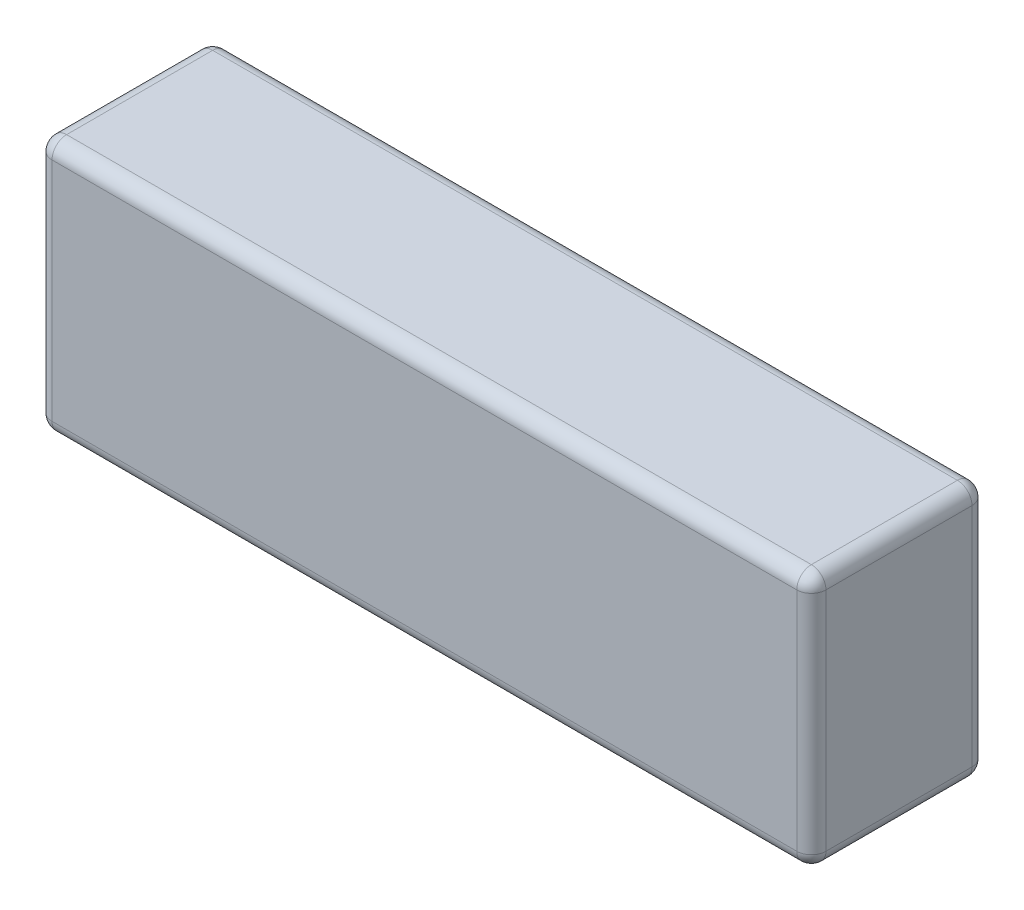
ISO-10303-21;
HEADER;
FILE_DESCRIPTION(('STEP AP214'),'2;1');
FILE_NAME('part.step','',(''),(''),'','','');
FILE_SCHEMA(('AUTOMOTIVE_DESIGN { 1 0 10303 214 1 1 1 1 }'));
ENDSEC;
DATA;
#1=APPLICATION_CONTEXT('core data for automotive mechanical design processes');
#2=APPLICATION_PROTOCOL_DEFINITION('international standard','automotive_design',2000,#1);
#3=PRODUCT_CONTEXT('',#1,'mechanical');
#4=PRODUCT('Part','Part','',(#3));
#5=PRODUCT_RELATED_PRODUCT_CATEGORY('part','',(#4));
#6=PRODUCT_DEFINITION_FORMATION('','',#4);
#7=PRODUCT_DEFINITION_CONTEXT('part definition',#1,'design');
#8=PRODUCT_DEFINITION('design','',#6,#7);
#9=PRODUCT_DEFINITION_SHAPE('','',#8);
#10=(LENGTH_UNIT() NAMED_UNIT(*) SI_UNIT(.MILLI.,.METRE.));
#11=(NAMED_UNIT(*) PLANE_ANGLE_UNIT() SI_UNIT($,.RADIAN.));
#12=(NAMED_UNIT(*) SI_UNIT($,.STERADIAN.) SOLID_ANGLE_UNIT());
#13=UNCERTAINTY_MEASURE_WITH_UNIT(LENGTH_MEASURE(1.E-05),#10,'distance_accuracy_value','');
#14=(GEOMETRIC_REPRESENTATION_CONTEXT(3) GLOBAL_UNCERTAINTY_ASSIGNED_CONTEXT((#13)) GLOBAL_UNIT_ASSIGNED_CONTEXT((#10,
#11,#12)) REPRESENTATION_CONTEXT('',''));
#15=CARTESIAN_POINT('',(0.,0.,0.));
#16=DIRECTION('',(0.,0.,1.));
#17=DIRECTION('',(1.,0.,0.));
#18=AXIS2_PLACEMENT_3D('',#15,#16,#17);
#19=CARTESIAN_POINT('',(-63.5650039022139,18.7208480700783,-11.4465056239155));
#20=DIRECTION('',(-1.,0.,0.));
#21=DIRECTION('',(0.,0.,1.));
#22=AXIS2_PLACEMENT_3D('',#19,#20,#21);
#23=PLANE('',#22);
#24=CARTESIAN_POINT('',(-63.5650039022139,18.7208480700783,-11.4465056239155));
#25=DIRECTION('',(-1.,0.,0.));
#26=DIRECTION('',(0.,0.,1.));
#27=AXIS2_PLACEMENT_3D('',#24,#25,#26);
#28=CIRCLE('',#27,7.98880999035675);
#29=CARTESIAN_POINT('',(-63.5650039022139,18.7208480700783,-19.4353156142722));
#30=VERTEX_POINT('',#29);
#31=CARTESIAN_POINT('',(-63.5650039022139,18.7208480700783,-3.45769563355872));
#32=VERTEX_POINT('',#31);
#33=EDGE_CURVE('E10',#30,#32,#28,.T.);
#34=ORIENTED_EDGE('',*,*,#33,.T.);
#35=CARTESIAN_POINT('',(-63.5650039022139,18.7208480700783,-11.4465056239155));
#36=DIRECTION('',(-1.,0.,0.));
#37=DIRECTION('',(0.,0.,1.));
#38=AXIS2_PLACEMENT_3D('',#35,#36,#37);
#39=CIRCLE('',#38,7.98880999035675);
#40=EDGE_CURVE('E204',#32,#30,#39,.T.);
#41=ORIENTED_EDGE('',*,*,#40,.T.);
#42=EDGE_LOOP('',(#34,#41));
#43=FACE_BOUND('',#42,.T.);
#44=ADVANCED_FACE('F16',(#43),#23,.T.);
#45=CARTESIAN_POINT('',(-63.5650039022139,18.7208480700783,-11.4465056239155));
#46=DIRECTION('',(1.,0.,0.));
#47=DIRECTION('',(0.,0.,-1.));
#48=AXIS2_PLACEMENT_3D('',#45,#46,#47);
#49=CYLINDRICAL_SURFACE('',#48,7.98880999035675);
#50=DIRECTION('',(1.,0.,0.));
#51=VECTOR('',#50,1.);
#52=CARTESIAN_POINT('',(-63.5650039022139,18.7208480700783,-3.45769563355872));
#53=LINE('',#52,#51);
#54=CARTESIAN_POINT('',(-62.5650039022139,18.7208480700783,-3.45769563355872));
#55=VERTEX_POINT('',#54);
#56=EDGE_CURVE('E206',#32,#55,#53,.T.);
#57=ORIENTED_EDGE('',*,*,#56,.F.);
#58=ORIENTED_EDGE('',*,*,#33,.F.);
#59=DIRECTION('',(1.,0.,0.));
#60=VECTOR('',#59,1.);
#61=CARTESIAN_POINT('',(-63.5650039022139,18.7208480700783,-19.4353156142722));
#62=LINE('',#61,#60);
#63=CARTESIAN_POINT('',(-62.5650039022139,18.7208480700783,-19.4353156142722));
#64=VERTEX_POINT('',#63);
#65=EDGE_CURVE('E209',#30,#64,#62,.T.);
#66=ORIENTED_EDGE('',*,*,#65,.T.);
#67=CARTESIAN_POINT('',(-62.5650039022139,18.7208480700783,-11.4465056239155));
#68=DIRECTION('',(-1.,0.,0.));
#69=DIRECTION('',(0.,0.,-1.));
#70=AXIS2_PLACEMENT_3D('',#67,#68,#69);
#71=CIRCLE('',#70,7.98880999035675);
#72=EDGE_CURVE('E241',#64,#55,#71,.T.);
#73=ORIENTED_EDGE('',*,*,#72,.T.);
#74=EDGE_LOOP('',(#57,#58,#66,#73));
#75=FACE_BOUND('',#74,.T.);
#76=ADVANCED_FACE('F436',(#75),#49,.T.);
#77=CARTESIAN_POINT('',(-60.5650039022139,35.,-0.807978011174984));
#78=DIRECTION('',(0.,-1.,0.));
#79=DIRECTION('',(0.,0.,-1.));
#80=AXIS2_PLACEMENT_3D('',#77,#78,#79);
#81=CYLINDRICAL_SURFACE('',#80,2.);
#82=CARTESIAN_POINT('',(-60.5650039022139,33.,-0.807978011174984));
#83=DIRECTION('',(0.,-1.,0.));
#84=DIRECTION('',(0.,0.,1.));
#85=AXIS2_PLACEMENT_3D('',#82,#83,#84);
#86=CIRCLE('',#85,2.);
#87=CARTESIAN_POINT('',(-60.5650039022139,33.,1.19202198882502));
#88=VERTEX_POINT('',#87);
#89=CARTESIAN_POINT('',(-62.5650039022139,33.,-0.807978011174984));
#90=VERTEX_POINT('',#89);
#91=EDGE_CURVE('E360',#88,#90,#86,.T.);
#92=ORIENTED_EDGE('',*,*,#91,.T.);
#93=DIRECTION('',(0.,1.,0.));
#94=VECTOR('',#93,1.);
#95=CARTESIAN_POINT('',(-62.5650039022139,35.,-0.807978011174986));
#96=LINE('',#95,#94);
#97=CARTESIAN_POINT('',(-62.5650039022139,2.,-0.807978011174984));
#98=VERTEX_POINT('',#97);
#99=EDGE_CURVE('E228',#98,#90,#96,.T.);
#100=ORIENTED_EDGE('',*,*,#99,.F.);
#101=CARTESIAN_POINT('',(-60.5650039022139,2.,-0.807978011174984));
#102=DIRECTION('',(0.,1.,0.));
#103=DIRECTION('',(0.,0.,-1.));
#104=AXIS2_PLACEMENT_3D('',#101,#102,#103);
#105=CIRCLE('',#104,2.);
#106=CARTESIAN_POINT('',(-60.5650039022139,2.,1.19202198882502));
#107=VERTEX_POINT('',#106);
#108=EDGE_CURVE('E24',#98,#107,#105,.T.);
#109=ORIENTED_EDGE('',*,*,#108,.T.);
#110=DIRECTION('',(0.,-1.,0.));
#111=VECTOR('',#110,1.);
#112=CARTESIAN_POINT('',(-60.5650039022139,35.,1.19202198882502));
#113=LINE('',#112,#111);
#114=EDGE_CURVE('E195',#88,#107,#113,.T.);
#115=ORIENTED_EDGE('',*,*,#114,.F.);
#116=EDGE_LOOP('',(#92,#100,#109,#115));
#117=FACE_BOUND('',#116,.T.);
#118=ADVANCED_FACE('F365',(#117),#81,.T.);
#119=CARTESIAN_POINT('',(-60.5650039022139,2.,-0.807978011174984));
#120=DIRECTION('',(1.,0.,0.));
#121=DIRECTION('',(0.,0.,-1.));
#122=AXIS2_PLACEMENT_3D('',#119,#120,#121);
#123=SPHERICAL_SURFACE('',#122,2.);
#124=CARTESIAN_POINT('',(-60.5650039022139,2.,-0.807978011174984));
#125=DIRECTION('',(0.,0.,1.));
#126=DIRECTION('',(1.,0.,0.));
#127=AXIS2_PLACEMENT_3D('',#124,#125,#126);
#128=CIRCLE('',#127,2.);
#129=CARTESIAN_POINT('',(-60.5650039022139,0.,-0.807978011174984));
#130=VERTEX_POINT('',#129);
#131=EDGE_CURVE('E353',#98,#130,#128,.T.);
#132=ORIENTED_EDGE('',*,*,#131,.T.);
#133=CARTESIAN_POINT('',(-60.5650039022139,2.,-0.807978011174984));
#134=DIRECTION('',(-1.,0.,0.));
#135=DIRECTION('',(0.,0.,1.));
#136=AXIS2_PLACEMENT_3D('',#133,#134,#135);
#137=CIRCLE('',#136,2.);
#138=EDGE_CURVE('E349',#130,#107,#137,.T.);
#139=ORIENTED_EDGE('',*,*,#138,.T.);
#140=ORIENTED_EDGE('',*,*,#108,.F.);
#141=EDGE_LOOP('',(#132,#139,#140));
#142=FACE_BOUND('',#141,.T.);
#143=ADVANCED_FACE('F370',(#142),#123,.T.);
#144=CARTESIAN_POINT('',(-60.5650039022139,33.,-0.807978011174984));
#145=DIRECTION('',(1.,0.,0.));
#146=DIRECTION('',(0.,0.,1.));
#147=AXIS2_PLACEMENT_3D('',#144,#145,#146);
#148=SPHERICAL_SURFACE('',#147,2.);
#149=CARTESIAN_POINT('',(-60.5650039022139,33.,-0.807978011174984));
#150=DIRECTION('',(-1.,0.,0.));
#151=DIRECTION('',(0.,0.,1.));
#152=AXIS2_PLACEMENT_3D('',#149,#150,#151);
#153=CIRCLE('',#152,2.);
#154=CARTESIAN_POINT('',(-60.5650039022139,35.,-0.807978011174984));
#155=VERTEX_POINT('',#154);
#156=EDGE_CURVE('E346',#88,#155,#153,.T.);
#157=ORIENTED_EDGE('',*,*,#156,.T.);
#158=CARTESIAN_POINT('',(-60.5650039022139,33.,-0.807978011174984));
#159=DIRECTION('',(0.,0.,1.));
#160=DIRECTION('',(1.,0.,0.));
#161=AXIS2_PLACEMENT_3D('',#158,#159,#160);
#162=CIRCLE('',#161,2.);
#163=EDGE_CURVE('E343',#155,#90,#162,.T.);
#164=ORIENTED_EDGE('',*,*,#163,.T.);
#165=ORIENTED_EDGE('',*,*,#91,.F.);
#166=EDGE_LOOP('',(#157,#164,#165));
#167=FACE_BOUND('',#166,.T.);
#168=ADVANCED_FACE('F391',(#167),#148,.T.);
#169=CARTESIAN_POINT('',(-60.5650039022139,2.,-22.807978011175));
#170=DIRECTION('',(0.,0.,-1.));
#171=DIRECTION('',(-1.,0.,0.));
#172=AXIS2_PLACEMENT_3D('',#169,#170,#171);
#173=CYLINDRICAL_SURFACE('',#172,2.);
#174=CARTESIAN_POINT('',(-60.5650039022139,2.,-20.807978011175));
#175=DIRECTION('',(0.,0.,1.));
#176=DIRECTION('',(-1.,0.,0.));
#177=AXIS2_PLACEMENT_3D('',#174,#175,#176);
#178=CIRCLE('',#177,2.);
#179=CARTESIAN_POINT('',(-62.5650039022139,2.,-20.807978011175));
#180=VERTEX_POINT('',#179);
#181=CARTESIAN_POINT('',(-60.5650039022139,0.,-20.807978011175));
#182=VERTEX_POINT('',#181);
#183=EDGE_CURVE('E48',#180,#182,#178,.T.);
#184=ORIENTED_EDGE('',*,*,#183,.T.);
#185=DIRECTION('',(0.,0.,-1.));
#186=VECTOR('',#185,1.);
#187=CARTESIAN_POINT('',(-60.5650039022139,0.,-22.807978011175));
#188=LINE('',#187,#186);
#189=EDGE_CURVE('E283',#130,#182,#188,.T.);
#190=ORIENTED_EDGE('',*,*,#189,.F.);
#191=ORIENTED_EDGE('',*,*,#131,.F.);
#192=DIRECTION('',(0.,0.,1.));
#193=VECTOR('',#192,1.);
#194=CARTESIAN_POINT('',(-62.5650039022139,2.,1.19202198882502));
#195=LINE('',#194,#193);
#196=EDGE_CURVE('E212',#180,#98,#195,.T.);
#197=ORIENTED_EDGE('',*,*,#196,.F.);
#198=EDGE_LOOP('',(#184,#190,#191,#197));
#199=FACE_BOUND('',#198,.T.);
#200=ADVANCED_FACE('F366',(#199),#173,.T.);
#201=CARTESIAN_POINT('',(43.4349960977861,2.,-0.807978011174984));
#202=DIRECTION('',(-1.,0.,0.));
#203=DIRECTION('',(0.,0.,1.));
#204=AXIS2_PLACEMENT_3D('',#201,#202,#203);
#205=CYLINDRICAL_SURFACE('',#204,2.);
#206=CARTESIAN_POINT('',(41.4349960977861,2.,-0.807978011174984));
#207=DIRECTION('',(-1.,0.,0.));
#208=DIRECTION('',(0.,0.,-1.));
#209=AXIS2_PLACEMENT_3D('',#206,#207,#208);
#210=CIRCLE('',#209,2.);
#211=CARTESIAN_POINT('',(41.4349960977861,0.,-0.807978011174984));
#212=VERTEX_POINT('',#211);
#213=CARTESIAN_POINT('',(41.4349960977861,2.,1.19202198882502));
#214=VERTEX_POINT('',#213);
#215=EDGE_CURVE('E152',#212,#214,#210,.T.);
#216=ORIENTED_EDGE('',*,*,#215,.T.);
#217=DIRECTION('',(1.,0.,0.));
#218=VECTOR('',#217,1.);
#219=CARTESIAN_POINT('',(43.4349960977861,2.,1.19202198882502));
#220=LINE('',#219,#218);
#221=EDGE_CURVE('E157',#107,#214,#220,.T.);
#222=ORIENTED_EDGE('',*,*,#221,.F.);
#223=ORIENTED_EDGE('',*,*,#138,.F.);
#224=DIRECTION('',(-1.,0.,0.));
#225=VECTOR('',#224,1.);
#226=CARTESIAN_POINT('',(-62.5650039022139,0.,-0.807978011174984));
#227=LINE('',#226,#225);
#228=EDGE_CURVE('E165',#212,#130,#227,.T.);
#229=ORIENTED_EDGE('',*,*,#228,.F.);
#230=EDGE_LOOP('',(#216,#222,#223,#229));
#231=FACE_BOUND('',#230,.T.);
#232=ADVANCED_FACE('F156',(#231),#205,.T.);
#233=CARTESIAN_POINT('',(0.,33.,-0.807978011174984));
#234=DIRECTION('',(1.,0.,0.));
#235=DIRECTION('',(0.,0.,-1.));
#236=AXIS2_PLACEMENT_3D('',#233,#234,#235);
#237=CYLINDRICAL_SURFACE('',#236,2.);
#238=CARTESIAN_POINT('',(41.4349960977861,33.,-0.807978011174984));
#239=DIRECTION('',(-1.,0.,0.));
#240=DIRECTION('',(0.,0.,-1.));
#241=AXIS2_PLACEMENT_3D('',#238,#239,#240);
#242=CIRCLE('',#241,2.);
#243=CARTESIAN_POINT('',(41.4349960977861,33.,1.19202198882502));
#244=VERTEX_POINT('',#243);
#245=CARTESIAN_POINT('',(41.4349960977861,35.,-0.807978011174984));
#246=VERTEX_POINT('',#245);
#247=EDGE_CURVE('E167',#244,#246,#242,.T.);
#248=ORIENTED_EDGE('',*,*,#247,.T.);
#249=DIRECTION('',(1.,0.,0.));
#250=VECTOR('',#249,1.);
#251=CARTESIAN_POINT('',(0.,35.,-0.807978011174984));
#252=LINE('',#251,#250);
#253=EDGE_CURVE('E273',#155,#246,#252,.T.);
#254=ORIENTED_EDGE('',*,*,#253,.F.);
#255=ORIENTED_EDGE('',*,*,#156,.F.);
#256=DIRECTION('',(-1.,0.,0.));
#257=VECTOR('',#256,1.);
#258=CARTESIAN_POINT('',(43.4349960977861,33.,1.19202198882502));
#259=LINE('',#258,#257);
#260=EDGE_CURVE('E199',#244,#88,#259,.T.);
#261=ORIENTED_EDGE('',*,*,#260,.F.);
#262=EDGE_LOOP('',(#248,#254,#255,#261));
#263=FACE_BOUND('',#262,.T.);
#264=ADVANCED_FACE('F390',(#263),#237,.T.);
#265=CARTESIAN_POINT('',(-60.5650039022139,33.,0.));
#266=DIRECTION('',(0.,0.,1.));
#267=DIRECTION('',(1.,0.,0.));
#268=AXIS2_PLACEMENT_3D('',#265,#266,#267);
#269=CYLINDRICAL_SURFACE('',#268,2.);
#270=CARTESIAN_POINT('',(-60.5650039022139,33.,-20.807978011175));
#271=DIRECTION('',(0.,0.,1.));
#272=DIRECTION('',(-1.,0.,0.));
#273=AXIS2_PLACEMENT_3D('',#270,#271,#272);
#274=CIRCLE('',#273,2.);
#275=CARTESIAN_POINT('',(-60.5650039022139,35.,-20.807978011175));
#276=VERTEX_POINT('',#275);
#277=CARTESIAN_POINT('',(-62.5650039022139,33.,-20.807978011175));
#278=VERTEX_POINT('',#277);
#279=EDGE_CURVE('E336',#276,#278,#274,.T.);
#280=ORIENTED_EDGE('',*,*,#279,.T.);
#281=DIRECTION('',(0.,0.,-1.));
#282=VECTOR('',#281,1.);
#283=CARTESIAN_POINT('',(-62.5650039022139,33.,-22.807978011175));
#284=LINE('',#283,#282);
#285=EDGE_CURVE('E233',#90,#278,#284,.T.);
#286=ORIENTED_EDGE('',*,*,#285,.F.);
#287=ORIENTED_EDGE('',*,*,#163,.F.);
#288=DIRECTION('',(0.,0.,1.));
#289=VECTOR('',#288,1.);
#290=CARTESIAN_POINT('',(-60.5650039022139,35.,0.));
#291=LINE('',#290,#289);
#292=EDGE_CURVE('E269',#276,#155,#291,.T.);
#293=ORIENTED_EDGE('',*,*,#292,.F.);
#294=EDGE_LOOP('',(#280,#286,#287,#293));
#295=FACE_BOUND('',#294,.T.);
#296=ADVANCED_FACE('F395',(#295),#269,.T.);
#297=CARTESIAN_POINT('',(-60.5650039022139,2.,-20.807978011175));
#298=DIRECTION('',(1.,0.,0.));
#299=DIRECTION('',(0.,1.,0.));
#300=AXIS2_PLACEMENT_3D('',#297,#298,#299);
#301=SPHERICAL_SURFACE('',#300,2.);
#302=CARTESIAN_POINT('',(-60.5650039022139,2.,-20.807978011175));
#303=DIRECTION('',(0.,-1.,0.));
#304=DIRECTION('',(0.,0.,-1.));
#305=AXIS2_PLACEMENT_3D('',#302,#303,#304);
#306=CIRCLE('',#305,2.);
#307=CARTESIAN_POINT('',(-60.5650039022139,2.,-22.807978011175));
#308=VERTEX_POINT('',#307);
#309=EDGE_CURVE('E334',#180,#308,#306,.T.);
#310=ORIENTED_EDGE('',*,*,#309,.T.);
#311=CARTESIAN_POINT('',(-60.5650039022139,2.,-20.807978011175));
#312=DIRECTION('',(-1.,0.,0.));
#313=DIRECTION('',(0.,0.,1.));
#314=AXIS2_PLACEMENT_3D('',#311,#312,#313);
#315=CIRCLE('',#314,2.);
#316=EDGE_CURVE('E297',#308,#182,#315,.T.);
#317=ORIENTED_EDGE('',*,*,#316,.T.);
#318=ORIENTED_EDGE('',*,*,#183,.F.);
#319=EDGE_LOOP('',(#310,#317,#318));
#320=FACE_BOUND('',#319,.T.);
#321=ADVANCED_FACE('F404',(#320),#301,.T.);
#322=CARTESIAN_POINT('',(41.4349960977861,2.,-0.807978011174984));
#323=DIRECTION('',(0.,1.,0.));
#324=DIRECTION('',(0.,0.,-1.));
#325=AXIS2_PLACEMENT_3D('',#322,#323,#324);
#326=SPHERICAL_SURFACE('',#325,2.);
#327=CARTESIAN_POINT('',(41.4349960977861,2.,-0.807978011174984));
#328=DIRECTION('',(0.,0.,1.));
#329=DIRECTION('',(1.,0.,0.));
#330=AXIS2_PLACEMENT_3D('',#327,#328,#329);
#331=CIRCLE('',#330,2.);
#332=CARTESIAN_POINT('',(43.4349960977861,2.,-0.807978011174986));
#333=VERTEX_POINT('',#332);
#334=EDGE_CURVE('E172',#212,#333,#331,.T.);
#335=ORIENTED_EDGE('',*,*,#334,.T.);
#336=CARTESIAN_POINT('',(41.4349960977861,2.,-0.807978011174986));
#337=DIRECTION('',(0.,-1.,0.));
#338=DIRECTION('',(0.,0.,-1.));
#339=AXIS2_PLACEMENT_3D('',#336,#337,#338);
#340=CIRCLE('',#339,2.);
#341=EDGE_CURVE('E166',#333,#214,#340,.T.);
#342=ORIENTED_EDGE('',*,*,#341,.T.);
#343=ORIENTED_EDGE('',*,*,#215,.F.);
#344=EDGE_LOOP('',(#335,#342,#343));
#345=FACE_BOUND('',#344,.T.);
#346=ADVANCED_FACE('F171',(#345),#326,.T.);
#347=CARTESIAN_POINT('',(41.4349960977861,33.,-0.807978011174984));
#348=DIRECTION('',(0.,1.,0.));
#349=DIRECTION('',(0.,0.,-1.));
#350=AXIS2_PLACEMENT_3D('',#347,#348,#349);
#351=SPHERICAL_SURFACE('',#350,2.);
#352=CARTESIAN_POINT('',(41.4349960977861,33.,-0.807978011174984));
#353=DIRECTION('',(0.,1.,0.));
#354=DIRECTION('',(0.,0.,1.));
#355=AXIS2_PLACEMENT_3D('',#352,#353,#354);
#356=CIRCLE('',#355,2.);
#357=CARTESIAN_POINT('',(43.4349960977861,33.,-0.807978011174986));
#358=VERTEX_POINT('',#357);
#359=EDGE_CURVE('E180',#244,#358,#356,.T.);
#360=ORIENTED_EDGE('',*,*,#359,.T.);
#361=CARTESIAN_POINT('',(41.4349960977861,33.,-0.807978011174986));
#362=DIRECTION('',(0.,0.,1.));
#363=DIRECTION('',(0.,-1.,0.));
#364=AXIS2_PLACEMENT_3D('',#361,#362,#363);
#365=CIRCLE('',#364,2.);
#366=EDGE_CURVE('E178',#358,#246,#365,.T.);
#367=ORIENTED_EDGE('',*,*,#366,.T.);
#368=ORIENTED_EDGE('',*,*,#247,.F.);
#369=EDGE_LOOP('',(#360,#367,#368));
#370=FACE_BOUND('',#369,.T.);
#371=ADVANCED_FACE('F383',(#370),#351,.T.);
#372=CARTESIAN_POINT('',(-60.5650039022139,33.,-20.807978011175));
#373=DIRECTION('',(0.,1.,0.));
#374=DIRECTION('',(-1.,0.,0.));
#375=AXIS2_PLACEMENT_3D('',#372,#373,#374);
#376=SPHERICAL_SURFACE('',#375,2.);
#377=CARTESIAN_POINT('',(-60.5650039022139,33.,-20.807978011175));
#378=DIRECTION('',(-1.,0.,0.));
#379=DIRECTION('',(0.,0.,1.));
#380=AXIS2_PLACEMENT_3D('',#377,#378,#379);
#381=CIRCLE('',#380,2.);
#382=CARTESIAN_POINT('',(-60.5650039022139,33.,-22.807978011175));
#383=VERTEX_POINT('',#382);
#384=EDGE_CURVE('E317',#276,#383,#381,.T.);
#385=ORIENTED_EDGE('',*,*,#384,.T.);
#386=CARTESIAN_POINT('',(-60.5650039022139,33.,-20.807978011175));
#387=DIRECTION('',(0.,1.,0.));
#388=DIRECTION('',(0.,0.,1.));
#389=AXIS2_PLACEMENT_3D('',#386,#387,#388);
#390=CIRCLE('',#389,2.);
#391=EDGE_CURVE('E302',#383,#278,#390,.T.);
#392=ORIENTED_EDGE('',*,*,#391,.T.);
#393=ORIENTED_EDGE('',*,*,#279,.F.);
#394=EDGE_LOOP('',(#385,#392,#393));
#395=FACE_BOUND('',#394,.T.);
#396=ADVANCED_FACE('F576',(#395),#376,.T.);
#397=CARTESIAN_POINT('',(-60.5650039022139,35.,-20.807978011175));
#398=DIRECTION('',(0.,-1.,0.));
#399=DIRECTION('',(0.,0.,-1.));
#400=AXIS2_PLACEMENT_3D('',#397,#398,#399);
#401=CYLINDRICAL_SURFACE('',#400,2.);
#402=ORIENTED_EDGE('',*,*,#391,.F.);
#403=DIRECTION('',(0.,1.,0.));
#404=VECTOR('',#403,1.);
#405=CARTESIAN_POINT('',(-60.5650039022139,35.,-22.807978011175));
#406=LINE('',#405,#404);
#407=EDGE_CURVE('E257',#308,#383,#406,.T.);
#408=ORIENTED_EDGE('',*,*,#407,.F.);
#409=ORIENTED_EDGE('',*,*,#309,.F.);
#410=DIRECTION('',(0.,-1.,0.));
#411=VECTOR('',#410,1.);
#412=CARTESIAN_POINT('',(-62.5650039022139,35.,-20.807978011175));
#413=LINE('',#412,#411);
#414=EDGE_CURVE('E236',#278,#180,#413,.T.);
#415=ORIENTED_EDGE('',*,*,#414,.F.);
#416=EDGE_LOOP('',(#402,#408,#409,#415));
#417=FACE_BOUND('',#416,.T.);
#418=ADVANCED_FACE('F405',(#417),#401,.T.);
#419=CARTESIAN_POINT('',(-62.5650039022139,2.,-20.807978011175));
#420=DIRECTION('',(1.,0.,0.));
#421=DIRECTION('',(0.,0.,-1.));
#422=AXIS2_PLACEMENT_3D('',#419,#420,#421);
#423=CYLINDRICAL_SURFACE('',#422,2.);
#424=CARTESIAN_POINT('',(41.4349960977861,2.,-20.807978011175));
#425=DIRECTION('',(-1.,0.,0.));
#426=DIRECTION('',(0.,0.,-1.));
#427=AXIS2_PLACEMENT_3D('',#424,#425,#426);
#428=CIRCLE('',#427,2.);
#429=CARTESIAN_POINT('',(41.4349960977861,2.,-22.807978011175));
#430=VERTEX_POINT('',#429);
#431=CARTESIAN_POINT('',(41.4349960977861,0.,-20.807978011175));
#432=VERTEX_POINT('',#431);
#433=EDGE_CURVE('E288',#430,#432,#428,.T.);
#434=ORIENTED_EDGE('',*,*,#433,.T.);
#435=DIRECTION('',(1.,0.,0.));
#436=VECTOR('',#435,1.);
#437=CARTESIAN_POINT('',(43.4349960977861,0.,-20.807978011175));
#438=LINE('',#437,#436);
#439=EDGE_CURVE('E293',#182,#432,#438,.T.);
#440=ORIENTED_EDGE('',*,*,#439,.F.);
#441=ORIENTED_EDGE('',*,*,#316,.F.);
#442=DIRECTION('',(-1.,0.,0.));
#443=VECTOR('',#442,1.);
#444=CARTESIAN_POINT('',(-62.5650039022139,2.,-22.807978011175));
#445=LINE('',#444,#443);
#446=EDGE_CURVE('E258',#430,#308,#445,.T.);
#447=ORIENTED_EDGE('',*,*,#446,.F.);
#448=EDGE_LOOP('',(#434,#440,#441,#447));
#449=FACE_BOUND('',#448,.T.);
#450=ADVANCED_FACE('F407',(#449),#423,.T.);
#451=CARTESIAN_POINT('',(41.4349960977861,2.,-22.807978011175));
#452=DIRECTION('',(0.,0.,1.));
#453=DIRECTION('',(1.,0.,0.));
#454=AXIS2_PLACEMENT_3D('',#451,#452,#453);
#455=CYLINDRICAL_SURFACE('',#454,2.);
#456=CARTESIAN_POINT('',(41.4349960977861,2.,-20.807978011175));
#457=DIRECTION('',(0.,0.,1.));
#458=DIRECTION('',(-1.,0.,0.));
#459=AXIS2_PLACEMENT_3D('',#456,#457,#458);
#460=CIRCLE('',#459,2.);
#461=CARTESIAN_POINT('',(43.4349960977861,2.,-20.807978011175));
#462=VERTEX_POINT('',#461);
#463=EDGE_CURVE('E40',#432,#462,#460,.T.);
#464=ORIENTED_EDGE('',*,*,#463,.T.);
#465=DIRECTION('',(0.,0.,-1.));
#466=VECTOR('',#465,1.);
#467=CARTESIAN_POINT('',(43.4349960977861,2.,-22.807978011175));
#468=LINE('',#467,#466);
#469=EDGE_CURVE('E222',#333,#462,#468,.T.);
#470=ORIENTED_EDGE('',*,*,#469,.F.);
#471=ORIENTED_EDGE('',*,*,#334,.F.);
#472=DIRECTION('',(0.,0.,1.));
#473=VECTOR('',#472,1.);
#474=CARTESIAN_POINT('',(41.4349960977861,0.,1.19202198882502));
#475=LINE('',#474,#473);
#476=EDGE_CURVE('E300',#432,#212,#475,.T.);
#477=ORIENTED_EDGE('',*,*,#476,.F.);
#478=EDGE_LOOP('',(#464,#470,#471,#477));
#479=FACE_BOUND('',#478,.T.);
#480=ADVANCED_FACE('F372',(#479),#455,.T.);
#481=CARTESIAN_POINT('',(41.4349960977861,35.,-0.807978011174986));
#482=DIRECTION('',(0.,-1.,0.));
#483=DIRECTION('',(0.,0.,-1.));
#484=AXIS2_PLACEMENT_3D('',#481,#482,#483);
#485=CYLINDRICAL_SURFACE('',#484,2.);
#486=ORIENTED_EDGE('',*,*,#341,.F.);
#487=DIRECTION('',(0.,-1.,0.));
#488=VECTOR('',#487,1.);
#489=CARTESIAN_POINT('',(43.4349960977861,35.,-0.807978011174986));
#490=LINE('',#489,#488);
#491=EDGE_CURVE('E187',#358,#333,#490,.T.);
#492=ORIENTED_EDGE('',*,*,#491,.F.);
#493=ORIENTED_EDGE('',*,*,#359,.F.);
#494=DIRECTION('',(0.,1.,0.));
#495=VECTOR('',#494,1.);
#496=CARTESIAN_POINT('',(41.4349960977861,35.,1.19202198882502));
#497=LINE('',#496,#495);
#498=EDGE_CURVE('E181',#214,#244,#497,.T.);
#499=ORIENTED_EDGE('',*,*,#498,.F.);
#500=EDGE_LOOP('',(#486,#492,#493,#499));
#501=FACE_BOUND('',#500,.T.);
#502=ADVANCED_FACE('F183',(#501),#485,.T.);
#503=CARTESIAN_POINT('',(41.4349960977861,33.,0.));
#504=DIRECTION('',(0.,0.,-1.));
#505=DIRECTION('',(-1.,0.,0.));
#506=AXIS2_PLACEMENT_3D('',#503,#504,#505);
#507=CYLINDRICAL_SURFACE('',#506,2.);
#508=CARTESIAN_POINT('',(41.4349960977861,33.,-20.807978011175));
#509=DIRECTION('',(0.,0.,1.));
#510=DIRECTION('',(-1.,0.,0.));
#511=AXIS2_PLACEMENT_3D('',#508,#509,#510);
#512=CIRCLE('',#511,2.);
#513=CARTESIAN_POINT('',(43.4349960977861,33.,-20.807978011175));
#514=VERTEX_POINT('',#513);
#515=CARTESIAN_POINT('',(41.4349960977861,35.,-20.807978011175));
#516=VERTEX_POINT('',#515);
#517=EDGE_CURVE('E287',#514,#516,#512,.T.);
#518=ORIENTED_EDGE('',*,*,#517,.T.);
#519=DIRECTION('',(0.,0.,-1.));
#520=VECTOR('',#519,1.);
#521=CARTESIAN_POINT('',(41.4349960977861,35.,0.));
#522=LINE('',#521,#520);
#523=EDGE_CURVE('E279',#246,#516,#522,.T.);
#524=ORIENTED_EDGE('',*,*,#523,.F.);
#525=ORIENTED_EDGE('',*,*,#366,.F.);
#526=DIRECTION('',(0.,0.,1.));
#527=VECTOR('',#526,1.);
#528=CARTESIAN_POINT('',(43.4349960977861,33.,-22.807978011175));
#529=LINE('',#528,#527);
#530=EDGE_CURVE('E249',#514,#358,#529,.T.);
#531=ORIENTED_EDGE('',*,*,#530,.F.);
#532=EDGE_LOOP('',(#518,#524,#525,#531));
#533=FACE_BOUND('',#532,.T.);
#534=ADVANCED_FACE('F381',(#533),#507,.T.);
#535=CARTESIAN_POINT('',(0.,33.,-20.807978011175));
#536=DIRECTION('',(-1.,0.,0.));
#537=DIRECTION('',(0.,0.,1.));
#538=AXIS2_PLACEMENT_3D('',#535,#536,#537);
#539=CYLINDRICAL_SURFACE('',#538,2.);
#540=CARTESIAN_POINT('',(41.4349960977861,33.,-20.807978011175));
#541=DIRECTION('',(-1.,0.,0.));
#542=DIRECTION('',(0.,0.,-1.));
#543=AXIS2_PLACEMENT_3D('',#540,#541,#542);
#544=CIRCLE('',#543,2.);
#545=CARTESIAN_POINT('',(41.4349960977861,33.,-22.807978011175));
#546=VERTEX_POINT('',#545);
#547=EDGE_CURVE('E285',#516,#546,#544,.T.);
#548=ORIENTED_EDGE('',*,*,#547,.T.);
#549=DIRECTION('',(1.,0.,0.));
#550=VECTOR('',#549,1.);
#551=CARTESIAN_POINT('',(-62.5650039022139,33.,-22.807978011175));
#552=LINE('',#551,#550);
#553=EDGE_CURVE('E219',#383,#546,#552,.T.);
#554=ORIENTED_EDGE('',*,*,#553,.F.);
#555=ORIENTED_EDGE('',*,*,#384,.F.);
#556=DIRECTION('',(-1.,0.,0.));
#557=VECTOR('',#556,1.);
#558=CARTESIAN_POINT('',(0.,35.,-20.807978011175));
#559=LINE('',#558,#557);
#560=EDGE_CURVE('E218',#516,#276,#559,.T.);
#561=ORIENTED_EDGE('',*,*,#560,.F.);
#562=EDGE_LOOP('',(#548,#554,#555,#561));
#563=FACE_BOUND('',#562,.T.);
#564=ADVANCED_FACE('F419',(#563),#539,.T.);
#565=CARTESIAN_POINT('',(41.4349960977861,2.,-20.807978011175));
#566=DIRECTION('',(0.,0.,1.));
#567=DIRECTION('',(0.,1.,0.));
#568=AXIS2_PLACEMENT_3D('',#565,#566,#567);
#569=SPHERICAL_SURFACE('',#568,2.);
#570=ORIENTED_EDGE('',*,*,#433,.F.);
#571=CARTESIAN_POINT('',(41.4349960977861,2.,-20.807978011175));
#572=DIRECTION('',(0.,-1.,0.));
#573=DIRECTION('',(0.,0.,-1.));
#574=AXIS2_PLACEMENT_3D('',#571,#572,#573);
#575=CIRCLE('',#574,2.);
#576=EDGE_CURVE('E310',#430,#462,#575,.T.);
#577=ORIENTED_EDGE('',*,*,#576,.T.);
#578=ORIENTED_EDGE('',*,*,#463,.F.);
#579=EDGE_LOOP('',(#570,#577,#578));
#580=FACE_BOUND('',#579,.T.);
#581=ADVANCED_FACE('F409',(#580),#569,.T.);
#582=CARTESIAN_POINT('',(41.4349960977861,33.,-20.807978011175));
#583=DIRECTION('',(0.,1.,0.));
#584=DIRECTION('',(-1.,0.,0.));
#585=AXIS2_PLACEMENT_3D('',#582,#583,#584);
#586=SPHERICAL_SURFACE('',#585,2.);
#587=ORIENTED_EDGE('',*,*,#517,.F.);
#588=CARTESIAN_POINT('',(41.4349960977861,33.,-20.807978011175));
#589=DIRECTION('',(0.,1.,0.));
#590=DIRECTION('',(0.,0.,1.));
#591=AXIS2_PLACEMENT_3D('',#588,#589,#590);
#592=CIRCLE('',#591,2.);
#593=EDGE_CURVE('E303',#514,#546,#592,.T.);
#594=ORIENTED_EDGE('',*,*,#593,.T.);
#595=ORIENTED_EDGE('',*,*,#547,.F.);
#596=EDGE_LOOP('',(#587,#594,#595));
#597=FACE_BOUND('',#596,.T.);
#598=ADVANCED_FACE('F421',(#597),#586,.T.);
#599=CARTESIAN_POINT('',(41.4349960977861,35.,-20.807978011175));
#600=DIRECTION('',(0.,-1.,0.));
#601=DIRECTION('',(0.,0.,-1.));
#602=AXIS2_PLACEMENT_3D('',#599,#600,#601);
#603=CYLINDRICAL_SURFACE('',#602,2.);
#604=ORIENTED_EDGE('',*,*,#593,.F.);
#605=DIRECTION('',(0.,1.,0.));
#606=VECTOR('',#605,1.);
#607=CARTESIAN_POINT('',(43.4349960977861,35.,-20.807978011175));
#608=LINE('',#607,#606);
#609=EDGE_CURVE('E223',#462,#514,#608,.T.);
#610=ORIENTED_EDGE('',*,*,#609,.F.);
#611=ORIENTED_EDGE('',*,*,#576,.F.);
#612=DIRECTION('',(0.,-1.,0.));
#613=VECTOR('',#612,1.);
#614=CARTESIAN_POINT('',(41.4349960977861,35.,-22.807978011175));
#615=LINE('',#614,#613);
#616=EDGE_CURVE('E214',#546,#430,#615,.T.);
#617=ORIENTED_EDGE('',*,*,#616,.F.);
#618=EDGE_LOOP('',(#604,#610,#611,#617));
#619=FACE_BOUND('',#618,.T.);
#620=ADVANCED_FACE('F411',(#619),#603,.T.);
#621=CARTESIAN_POINT('',(0.,0.,0.));
#622=DIRECTION('',(0.,-1.,0.));
#623=DIRECTION('',(0.,0.,-1.));
#624=AXIS2_PLACEMENT_3D('',#621,#622,#623);
#625=PLANE('',#624);
#626=ORIENTED_EDGE('',*,*,#228,.T.);
#627=ORIENTED_EDGE('',*,*,#189,.T.);
#628=ORIENTED_EDGE('',*,*,#439,.T.);
#629=ORIENTED_EDGE('',*,*,#476,.T.);
#630=EDGE_LOOP('',(#626,#627,#628,#629));
#631=FACE_BOUND('',#630,.T.);
#632=ADVANCED_FACE('F367',(#631),#625,.T.);
#633=CARTESIAN_POINT('',(0.,35.,0.));
#634=DIRECTION('',(0.,-1.,0.));
#635=DIRECTION('',(0.,0.,-1.));
#636=AXIS2_PLACEMENT_3D('',#633,#634,#635);
#637=PLANE('',#636);
#638=ORIENTED_EDGE('',*,*,#560,.T.);
#639=ORIENTED_EDGE('',*,*,#292,.T.);
#640=ORIENTED_EDGE('',*,*,#253,.T.);
#641=ORIENTED_EDGE('',*,*,#523,.T.);
#642=EDGE_LOOP('',(#638,#639,#640,#641));
#643=FACE_BOUND('',#642,.T.);
#644=ADVANCED_FACE('F481',(#643),#637,.F.);
#645=CARTESIAN_POINT('',(-62.5650039022139,35.,-22.807978011175));
#646=DIRECTION('',(0.,0.,1.));
#647=DIRECTION('',(1.,0.,0.));
#648=AXIS2_PLACEMENT_3D('',#645,#646,#647);
#649=PLANE('',#648);
#650=ORIENTED_EDGE('',*,*,#446,.T.);
#651=ORIENTED_EDGE('',*,*,#407,.T.);
#652=ORIENTED_EDGE('',*,*,#553,.T.);
#653=ORIENTED_EDGE('',*,*,#616,.T.);
#654=EDGE_LOOP('',(#650,#651,#652,#653));
#655=FACE_BOUND('',#654,.T.);
#656=ADVANCED_FACE('F418',(#655),#649,.F.);
#657=CARTESIAN_POINT('',(43.4349960977861,35.,-22.807978011175));
#658=DIRECTION('',(-1.,0.,0.));
#659=DIRECTION('',(0.,0.,1.));
#660=AXIS2_PLACEMENT_3D('',#657,#658,#659);
#661=PLANE('',#660);
#662=ORIENTED_EDGE('',*,*,#491,.T.);
#663=ORIENTED_EDGE('',*,*,#469,.T.);
#664=ORIENTED_EDGE('',*,*,#609,.T.);
#665=ORIENTED_EDGE('',*,*,#530,.T.);
#666=EDGE_LOOP('',(#662,#663,#664,#665));
#667=FACE_BOUND('',#666,.T.);
#668=ADVANCED_FACE('F376',(#667),#661,.F.);
#669=CARTESIAN_POINT('',(43.4349960977861,35.,1.19202198882502));
#670=DIRECTION('',(0.,0.,-1.));
#671=DIRECTION('',(0.,-1.,0.));
#672=AXIS2_PLACEMENT_3D('',#669,#670,#671);
#673=PLANE('',#672);
#674=ORIENTED_EDGE('',*,*,#260,.T.);
#675=ORIENTED_EDGE('',*,*,#114,.T.);
#676=ORIENTED_EDGE('',*,*,#221,.T.);
#677=ORIENTED_EDGE('',*,*,#498,.T.);
#678=EDGE_LOOP('',(#674,#675,#676,#677));
#679=FACE_BOUND('',#678,.T.);
#680=ADVANCED_FACE('F189',(#679),#673,.F.);
#681=CARTESIAN_POINT('',(-62.5650039022139,35.,-22.807978011175));
#682=DIRECTION('',(1.,0.,0.));
#683=DIRECTION('',(0.,1.,0.));
#684=AXIS2_PLACEMENT_3D('',#681,#682,#683);
#685=PLANE('',#684);
#686=ORIENTED_EDGE('',*,*,#72,.F.);
#687=CARTESIAN_POINT('',(-62.5650039022139,18.7208480700783,-11.4465056239155));
#688=DIRECTION('',(-1.,0.,0.));
#689=DIRECTION('',(0.,0.,-1.));
#690=AXIS2_PLACEMENT_3D('',#687,#688,#689);
#691=CIRCLE('',#690,7.98880999035675);
#692=EDGE_CURVE('E207',#55,#64,#691,.T.);
#693=ORIENTED_EDGE('',*,*,#692,.F.);
#694=EDGE_LOOP('',(#686,#693));
#695=FACE_BOUND('',#694,.T.);
#696=ORIENTED_EDGE('',*,*,#196,.T.);
#697=ORIENTED_EDGE('',*,*,#99,.T.);
#698=ORIENTED_EDGE('',*,*,#285,.T.);
#699=ORIENTED_EDGE('',*,*,#414,.T.);
#700=EDGE_LOOP('',(#696,#697,#698,#699));
#701=FACE_BOUND('',#700,.T.);
#702=ADVANCED_FACE('F400',(#695,#701),#685,.F.);
#703=CARTESIAN_POINT('',(-63.5650039022139,18.7208480700783,-11.4465056239155));
#704=DIRECTION('',(1.,0.,0.));
#705=DIRECTION('',(0.,0.,-1.));
#706=AXIS2_PLACEMENT_3D('',#703,#704,#705);
#707=CYLINDRICAL_SURFACE('',#706,7.98880999035675);
#708=ORIENTED_EDGE('',*,*,#40,.F.);
#709=ORIENTED_EDGE('',*,*,#56,.T.);
#710=ORIENTED_EDGE('',*,*,#692,.T.);
#711=ORIENTED_EDGE('',*,*,#65,.F.);
#712=EDGE_LOOP('',(#708,#709,#710,#711));
#713=FACE_BOUND('',#712,.T.);
#714=ADVANCED_FACE('F451',(#713),#707,.T.);
#715=CLOSED_SHELL('',(#44,#76,#118,#143,#168,#200,#232,#264,#296,#321,#346,#371,#396,#418,#450,
#480,#502,#534,#564,#581,#598,#620,#632,#644,#656,#668,#680,#702,#714));
#716=MANIFOLD_SOLID_BREP('B1',#715);
#717=ADVANCED_BREP_SHAPE_REPRESENTATION('',(#18,#716),#14);
#718=SHAPE_DEFINITION_REPRESENTATION(#9,#717);
ENDSEC;
END-ISO-10303-21;
